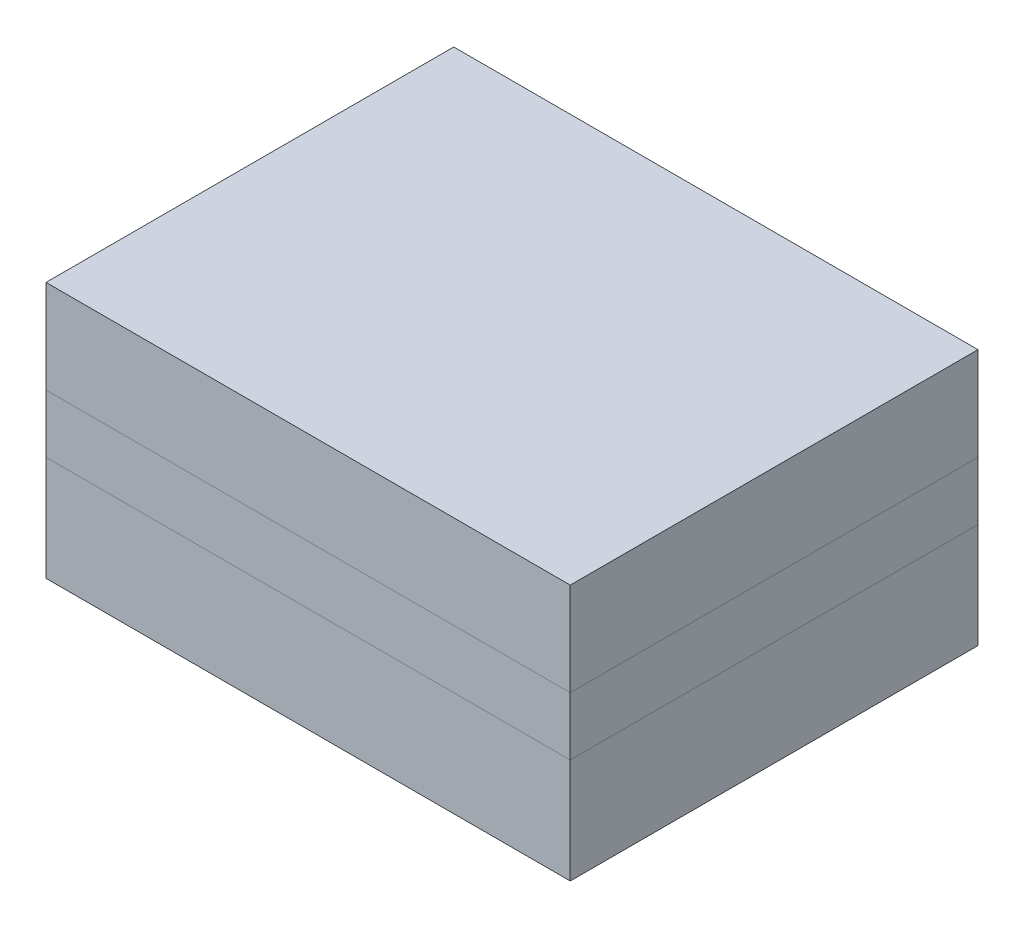
ISO-10303-21;
HEADER;
FILE_DESCRIPTION(('STEP AP214'),'2;1');
FILE_NAME('part.step','',(''),(''),'','','');
FILE_SCHEMA(('AUTOMOTIVE_DESIGN { 1 0 10303 214 1 1 1 1 }'));
ENDSEC;
DATA;
#1=APPLICATION_CONTEXT('core data for automotive mechanical design processes');
#2=APPLICATION_PROTOCOL_DEFINITION('international standard','automotive_design',2000,#1);
#3=PRODUCT_CONTEXT('',#1,'mechanical');
#4=PRODUCT('Part','Part','',(#3));
#5=PRODUCT_RELATED_PRODUCT_CATEGORY('part','',(#4));
#6=PRODUCT_DEFINITION_FORMATION('','',#4);
#7=PRODUCT_DEFINITION_CONTEXT('part definition',#1,'design');
#8=PRODUCT_DEFINITION('design','',#6,#7);
#9=PRODUCT_DEFINITION_SHAPE('','',#8);
#10=(LENGTH_UNIT() NAMED_UNIT(*) SI_UNIT(.MILLI.,.METRE.));
#11=(NAMED_UNIT(*) PLANE_ANGLE_UNIT() SI_UNIT($,.RADIAN.));
#12=(NAMED_UNIT(*) SI_UNIT($,.STERADIAN.) SOLID_ANGLE_UNIT());
#13=UNCERTAINTY_MEASURE_WITH_UNIT(LENGTH_MEASURE(1.E-05),#10,'distance_accuracy_value','');
#14=(GEOMETRIC_REPRESENTATION_CONTEXT(3) GLOBAL_UNCERTAINTY_ASSIGNED_CONTEXT((#13)) GLOBAL_UNIT_ASSIGNED_CONTEXT((#10,
#11,#12)) REPRESENTATION_CONTEXT('',''));
#15=CARTESIAN_POINT('',(0.,0.,0.));
#16=DIRECTION('',(0.,0.,1.));
#17=DIRECTION('',(1.,0.,0.));
#18=AXIS2_PLACEMENT_3D('',#15,#16,#17);
#19=CARTESIAN_POINT('',(0.,22.,-35.));
#20=DIRECTION('',(1.,0.,0.));
#21=DIRECTION('',(0.,0.,-1.));
#22=AXIS2_PLACEMENT_3D('',#19,#20,#21);
#23=PLANE('',#22);
#24=DIRECTION('',(0.,0.,1.));
#25=VECTOR('',#24,1.);
#26=CARTESIAN_POINT('',(0.,14.,-35.));
#27=LINE('',#26,#25);
#28=CARTESIAN_POINT('',(0.,14.,-35.));
#29=VERTEX_POINT('',#28);
#30=CARTESIAN_POINT('',(0.,14.,0.));
#31=VERTEX_POINT('',#30);
#32=EDGE_CURVE('E117',#29,#31,#27,.T.);
#33=ORIENTED_EDGE('',*,*,#32,.T.);
#34=DIRECTION('',(0.,-1.,0.));
#35=VECTOR('',#34,1.);
#36=CARTESIAN_POINT('',(0.,22.,0.));
#37=LINE('',#36,#35);
#38=CARTESIAN_POINT('',(0.,22.,0.));
#39=VERTEX_POINT('',#38);
#40=EDGE_CURVE('E12',#39,#31,#37,.T.);
#41=ORIENTED_EDGE('',*,*,#40,.F.);
#42=DIRECTION('',(0.,0.,1.));
#43=VECTOR('',#42,1.);
#44=CARTESIAN_POINT('',(0.,22.,-35.));
#45=LINE('',#44,#43);
#46=CARTESIAN_POINT('',(0.,22.,-35.));
#47=VERTEX_POINT('',#46);
#48=EDGE_CURVE('E105',#47,#39,#45,.T.);
#49=ORIENTED_EDGE('',*,*,#48,.F.);
#50=DIRECTION('',(0.,-1.,0.));
#51=VECTOR('',#50,1.);
#52=CARTESIAN_POINT('',(0.,22.,-35.));
#53=LINE('',#52,#51);
#54=EDGE_CURVE('E113',#47,#29,#53,.T.);
#55=ORIENTED_EDGE('',*,*,#54,.T.);
#56=EDGE_LOOP('',(#33,#41,#49,#55));
#57=FACE_BOUND('',#56,.T.);
#58=ADVANCED_FACE('F54',(#57),#23,.F.);
#59=CARTESIAN_POINT('',(0.,22.,0.));
#60=DIRECTION('',(0.,0.,-1.));
#61=DIRECTION('',(-1.,0.,0.));
#62=AXIS2_PLACEMENT_3D('',#59,#60,#61);
#63=PLANE('',#62);
#64=DIRECTION('',(1.,0.,0.));
#65=VECTOR('',#64,1.);
#66=CARTESIAN_POINT('',(0.,14.,0.));
#67=LINE('',#66,#65);
#68=CARTESIAN_POINT('',(45.,14.,0.));
#69=VERTEX_POINT('',#68);
#70=EDGE_CURVE('E109',#31,#69,#67,.T.);
#71=ORIENTED_EDGE('',*,*,#70,.T.);
#72=DIRECTION('',(0.,-1.,0.));
#73=VECTOR('',#72,1.);
#74=CARTESIAN_POINT('',(45.,22.,0.));
#75=LINE('',#74,#73);
#76=CARTESIAN_POINT('',(45.,22.,0.));
#77=VERTEX_POINT('',#76);
#78=EDGE_CURVE('E62',#77,#69,#75,.T.);
#79=ORIENTED_EDGE('',*,*,#78,.F.);
#80=DIRECTION('',(1.,0.,0.));
#81=VECTOR('',#80,1.);
#82=CARTESIAN_POINT('',(0.,22.,0.));
#83=LINE('',#82,#81);
#84=EDGE_CURVE('E100',#39,#77,#83,.T.);
#85=ORIENTED_EDGE('',*,*,#84,.F.);
#86=ORIENTED_EDGE('',*,*,#40,.T.);
#87=EDGE_LOOP('',(#71,#79,#85,#86));
#88=FACE_BOUND('',#87,.T.);
#89=ADVANCED_FACE('F108',(#88),#63,.F.);
#90=CARTESIAN_POINT('',(45.,22.,-35.));
#91=DIRECTION('',(-1.,0.,0.));
#92=DIRECTION('',(0.,0.,1.));
#93=AXIS2_PLACEMENT_3D('',#90,#91,#92);
#94=PLANE('',#93);
#95=DIRECTION('',(0.,0.,-1.));
#96=VECTOR('',#95,1.);
#97=CARTESIAN_POINT('',(45.,14.,-35.));
#98=LINE('',#97,#96);
#99=CARTESIAN_POINT('',(45.,14.,-35.));
#100=VERTEX_POINT('',#99);
#101=EDGE_CURVE('E87',#69,#100,#98,.T.);
#102=ORIENTED_EDGE('',*,*,#101,.T.);
#103=DIRECTION('',(0.,-1.,0.));
#104=VECTOR('',#103,1.);
#105=CARTESIAN_POINT('',(45.,22.,-35.));
#106=LINE('',#105,#104);
#107=CARTESIAN_POINT('',(45.,22.,-35.));
#108=VERTEX_POINT('',#107);
#109=EDGE_CURVE('E110',#108,#100,#106,.T.);
#110=ORIENTED_EDGE('',*,*,#109,.F.);
#111=DIRECTION('',(0.,0.,-1.));
#112=VECTOR('',#111,1.);
#113=CARTESIAN_POINT('',(45.,22.,-35.));
#114=LINE('',#113,#112);
#115=EDGE_CURVE('E103',#77,#108,#114,.T.);
#116=ORIENTED_EDGE('',*,*,#115,.F.);
#117=ORIENTED_EDGE('',*,*,#78,.T.);
#118=EDGE_LOOP('',(#102,#110,#116,#117));
#119=FACE_BOUND('',#118,.T.);
#120=ADVANCED_FACE('F111',(#119),#94,.F.);
#121=CARTESIAN_POINT('',(0.,22.,-35.));
#122=DIRECTION('',(0.,0.,1.));
#123=DIRECTION('',(1.,0.,0.));
#124=AXIS2_PLACEMENT_3D('',#121,#122,#123);
#125=PLANE('',#124);
#126=DIRECTION('',(-1.,0.,0.));
#127=VECTOR('',#126,1.);
#128=CARTESIAN_POINT('',(0.,14.,-35.));
#129=LINE('',#128,#127);
#130=EDGE_CURVE('E93',#100,#29,#129,.T.);
#131=ORIENTED_EDGE('',*,*,#130,.T.);
#132=ORIENTED_EDGE('',*,*,#54,.F.);
#133=DIRECTION('',(-1.,0.,0.));
#134=VECTOR('',#133,1.);
#135=CARTESIAN_POINT('',(0.,22.,-35.));
#136=LINE('',#135,#134);
#137=EDGE_CURVE('E70',#108,#47,#136,.T.);
#138=ORIENTED_EDGE('',*,*,#137,.F.);
#139=ORIENTED_EDGE('',*,*,#109,.T.);
#140=EDGE_LOOP('',(#131,#132,#138,#139));
#141=FACE_BOUND('',#140,.T.);
#142=ADVANCED_FACE('F124',(#141),#125,.F.);
#143=CARTESIAN_POINT('',(0.,22.,0.));
#144=DIRECTION('',(0.,1.,0.));
#145=DIRECTION('',(0.,0.,1.));
#146=AXIS2_PLACEMENT_3D('',#143,#144,#145);
#147=PLANE('',#146);
#148=ORIENTED_EDGE('',*,*,#48,.T.);
#149=ORIENTED_EDGE('',*,*,#84,.T.);
#150=ORIENTED_EDGE('',*,*,#115,.T.);
#151=ORIENTED_EDGE('',*,*,#137,.T.);
#152=EDGE_LOOP('',(#148,#149,#150,#151));
#153=FACE_BOUND('',#152,.T.);
#154=ADVANCED_FACE('F101',(#153),#147,.T.);
#155=CARTESIAN_POINT('',(0.,14.,0.));
#156=DIRECTION('',(0.,1.,0.));
#157=DIRECTION('',(0.,0.,1.));
#158=AXIS2_PLACEMENT_3D('',#155,#156,#157);
#159=PLANE('',#158);
#160=ORIENTED_EDGE('',*,*,#32,.F.);
#161=ORIENTED_EDGE('',*,*,#130,.F.);
#162=ORIENTED_EDGE('',*,*,#101,.F.);
#163=ORIENTED_EDGE('',*,*,#70,.F.);
#164=EDGE_LOOP('',(#160,#161,#162,#163));
#165=FACE_BOUND('',#164,.T.);
#166=ADVANCED_FACE('F127',(#165),#159,.F.);
#167=CLOSED_SHELL('',(#58,#89,#120,#142,#154,#166));
#168=MANIFOLD_SOLID_BREP('B2',#167);
#169=CARTESIAN_POINT('',(0.,14.,0.));
#170=DIRECTION('',(0.,1.,0.));
#171=DIRECTION('',(0.,0.,1.));
#172=AXIS2_PLACEMENT_3D('',#169,#170,#171);
#173=PLANE('',#172);
#174=DIRECTION('',(0.,0.,1.));
#175=VECTOR('',#174,1.);
#176=CARTESIAN_POINT('',(0.,14.,-35.));
#177=LINE('',#176,#175);
#178=CARTESIAN_POINT('',(0.,14.,-35.));
#179=VERTEX_POINT('',#178);
#180=CARTESIAN_POINT('',(0.,14.,0.));
#181=VERTEX_POINT('',#180);
#182=EDGE_CURVE('E288',#179,#181,#177,.T.);
#183=ORIENTED_EDGE('',*,*,#182,.T.);
#184=DIRECTION('',(1.,0.,0.));
#185=VECTOR('',#184,1.);
#186=CARTESIAN_POINT('',(0.,14.,0.));
#187=LINE('',#186,#185);
#188=CARTESIAN_POINT('',(45.,14.,0.));
#189=VERTEX_POINT('',#188);
#190=EDGE_CURVE('E291',#181,#189,#187,.T.);
#191=ORIENTED_EDGE('',*,*,#190,.T.);
#192=DIRECTION('',(0.,0.,-1.));
#193=VECTOR('',#192,1.);
#194=CARTESIAN_POINT('',(45.,14.,-35.));
#195=LINE('',#194,#193);
#196=CARTESIAN_POINT('',(45.,14.,-35.));
#197=VERTEX_POINT('',#196);
#198=EDGE_CURVE('E294',#189,#197,#195,.T.);
#199=ORIENTED_EDGE('',*,*,#198,.T.);
#200=DIRECTION('',(-1.,0.,0.));
#201=VECTOR('',#200,1.);
#202=CARTESIAN_POINT('',(0.,14.,-35.));
#203=LINE('',#202,#201);
#204=EDGE_CURVE('E296',#197,#179,#203,.T.);
#205=ORIENTED_EDGE('',*,*,#204,.T.);
#206=EDGE_LOOP('',(#183,#191,#199,#205));
#207=FACE_BOUND('',#206,.T.);
#208=DIRECTION('',(0.,0.,1.));
#209=VECTOR('',#208,1.);
#210=CARTESIAN_POINT('',(10.,14.,-25.));
#211=LINE('',#210,#209);
#212=CARTESIAN_POINT('',(10.,14.,-25.));
#213=VERTEX_POINT('',#212);
#214=CARTESIAN_POINT('',(10.,14.,-10.));
#215=VERTEX_POINT('',#214);
#216=EDGE_CURVE('E260',#213,#215,#211,.T.);
#217=ORIENTED_EDGE('',*,*,#216,.F.);
#218=DIRECTION('',(-1.,0.,0.));
#219=VECTOR('',#218,1.);
#220=CARTESIAN_POINT('',(10.,14.,-25.));
#221=LINE('',#220,#219);
#222=CARTESIAN_POINT('',(35.,14.,-25.));
#223=VERTEX_POINT('',#222);
#224=EDGE_CURVE('E252',#223,#213,#221,.T.);
#225=ORIENTED_EDGE('',*,*,#224,.F.);
#226=DIRECTION('',(0.,0.,-1.));
#227=VECTOR('',#226,1.);
#228=CARTESIAN_POINT('',(35.,14.,-25.));
#229=LINE('',#228,#227);
#230=CARTESIAN_POINT('',(35.,14.,-10.));
#231=VERTEX_POINT('',#230);
#232=EDGE_CURVE('E274',#231,#223,#229,.T.);
#233=ORIENTED_EDGE('',*,*,#232,.F.);
#234=DIRECTION('',(1.,0.,0.));
#235=VECTOR('',#234,1.);
#236=CARTESIAN_POINT('',(10.,14.,-10.));
#237=LINE('',#236,#235);
#238=EDGE_CURVE('E272',#215,#231,#237,.T.);
#239=ORIENTED_EDGE('',*,*,#238,.F.);
#240=EDGE_LOOP('',(#217,#225,#233,#239));
#241=FACE_BOUND('',#240,.T.);
#242=ADVANCED_FACE('F187',(#207,#241),#173,.T.);
#243=CARTESIAN_POINT('',(0.,9.,0.));
#244=DIRECTION('',(0.,1.,0.));
#245=DIRECTION('',(0.,0.,1.));
#246=AXIS2_PLACEMENT_3D('',#243,#244,#245);
#247=PLANE('',#246);
#248=DIRECTION('',(0.,0.,1.));
#249=VECTOR('',#248,1.);
#250=CARTESIAN_POINT('',(0.,9.,-35.));
#251=LINE('',#250,#249);
#252=CARTESIAN_POINT('',(0.,9.,-35.));
#253=VERTEX_POINT('',#252);
#254=CARTESIAN_POINT('',(0.,9.,0.));
#255=VERTEX_POINT('',#254);
#256=EDGE_CURVE('E268',#253,#255,#251,.T.);
#257=ORIENTED_EDGE('',*,*,#256,.F.);
#258=DIRECTION('',(-1.,0.,0.));
#259=VECTOR('',#258,1.);
#260=CARTESIAN_POINT('',(0.,9.,-35.));
#261=LINE('',#260,#259);
#262=CARTESIAN_POINT('',(45.,9.,-35.));
#263=VERTEX_POINT('',#262);
#264=EDGE_CURVE('E292',#263,#253,#261,.T.);
#265=ORIENTED_EDGE('',*,*,#264,.F.);
#266=DIRECTION('',(0.,0.,-1.));
#267=VECTOR('',#266,1.);
#268=CARTESIAN_POINT('',(45.,9.,-35.));
#269=LINE('',#268,#267);
#270=CARTESIAN_POINT('',(45.,9.,0.));
#271=VERTEX_POINT('',#270);
#272=EDGE_CURVE('E303',#271,#263,#269,.T.);
#273=ORIENTED_EDGE('',*,*,#272,.F.);
#274=DIRECTION('',(1.,0.,0.));
#275=VECTOR('',#274,1.);
#276=CARTESIAN_POINT('',(0.,9.,0.));
#277=LINE('',#276,#275);
#278=EDGE_CURVE('E301',#255,#271,#277,.T.);
#279=ORIENTED_EDGE('',*,*,#278,.F.);
#280=EDGE_LOOP('',(#257,#265,#273,#279));
#281=FACE_BOUND('',#280,.T.);
#282=DIRECTION('',(-1.,0.,0.));
#283=VECTOR('',#282,1.);
#284=CARTESIAN_POINT('',(10.,9.,-25.));
#285=LINE('',#284,#283);
#286=CARTESIAN_POINT('',(35.,9.,-25.));
#287=VERTEX_POINT('',#286);
#288=CARTESIAN_POINT('',(10.,9.,-25.));
#289=VERTEX_POINT('',#288);
#290=EDGE_CURVE('E210',#287,#289,#285,.T.);
#291=ORIENTED_EDGE('',*,*,#290,.T.);
#292=DIRECTION('',(0.,0.,1.));
#293=VECTOR('',#292,1.);
#294=CARTESIAN_POINT('',(10.,9.,-25.));
#295=LINE('',#294,#293);
#296=CARTESIAN_POINT('',(10.,9.,-10.));
#297=VERTEX_POINT('',#296);
#298=EDGE_CURVE('E267',#289,#297,#295,.T.);
#299=ORIENTED_EDGE('',*,*,#298,.T.);
#300=DIRECTION('',(1.,0.,0.));
#301=VECTOR('',#300,1.);
#302=CARTESIAN_POINT('',(10.,9.,-10.));
#303=LINE('',#302,#301);
#304=CARTESIAN_POINT('',(35.,9.,-10.));
#305=VERTEX_POINT('',#304);
#306=EDGE_CURVE('E280',#297,#305,#303,.T.);
#307=ORIENTED_EDGE('',*,*,#306,.T.);
#308=DIRECTION('',(0.,0.,-1.));
#309=VECTOR('',#308,1.);
#310=CARTESIAN_POINT('',(35.,9.,-25.));
#311=LINE('',#310,#309);
#312=EDGE_CURVE('E261',#305,#287,#311,.T.);
#313=ORIENTED_EDGE('',*,*,#312,.T.);
#314=EDGE_LOOP('',(#291,#299,#307,#313));
#315=FACE_BOUND('',#314,.T.);
#316=ADVANCED_FACE('F321',(#281,#315),#247,.F.);
#317=CARTESIAN_POINT('',(0.,14.,-35.));
#318=DIRECTION('',(1.,0.,0.));
#319=DIRECTION('',(0.,0.,-1.));
#320=AXIS2_PLACEMENT_3D('',#317,#318,#319);
#321=PLANE('',#320);
#322=ORIENTED_EDGE('',*,*,#256,.T.);
#323=DIRECTION('',(0.,-1.,0.));
#324=VECTOR('',#323,1.);
#325=CARTESIAN_POINT('',(0.,14.,0.));
#326=LINE('',#325,#324);
#327=EDGE_CURVE('E52',#181,#255,#326,.T.);
#328=ORIENTED_EDGE('',*,*,#327,.F.);
#329=ORIENTED_EDGE('',*,*,#182,.F.);
#330=DIRECTION('',(0.,-1.,0.));
#331=VECTOR('',#330,1.);
#332=CARTESIAN_POINT('',(0.,14.,-35.));
#333=LINE('',#332,#331);
#334=EDGE_CURVE('E298',#179,#253,#333,.T.);
#335=ORIENTED_EDGE('',*,*,#334,.T.);
#336=EDGE_LOOP('',(#322,#328,#329,#335));
#337=FACE_BOUND('',#336,.T.);
#338=ADVANCED_FACE('F189',(#337),#321,.F.);
#339=CARTESIAN_POINT('',(0.,14.,0.));
#340=DIRECTION('',(0.,0.,-1.));
#341=DIRECTION('',(-1.,0.,0.));
#342=AXIS2_PLACEMENT_3D('',#339,#340,#341);
#343=PLANE('',#342);
#344=ORIENTED_EDGE('',*,*,#278,.T.);
#345=DIRECTION('',(0.,-1.,0.));
#346=VECTOR('',#345,1.);
#347=CARTESIAN_POINT('',(45.,14.,0.));
#348=LINE('',#347,#346);
#349=EDGE_CURVE('E195',#189,#271,#348,.T.);
#350=ORIENTED_EDGE('',*,*,#349,.F.);
#351=ORIENTED_EDGE('',*,*,#190,.F.);
#352=ORIENTED_EDGE('',*,*,#327,.T.);
#353=EDGE_LOOP('',(#344,#350,#351,#352));
#354=FACE_BOUND('',#353,.T.);
#355=ADVANCED_FACE('F331',(#354),#343,.F.);
#356=CARTESIAN_POINT('',(45.,14.,-35.));
#357=DIRECTION('',(-1.,0.,0.));
#358=DIRECTION('',(0.,0.,1.));
#359=AXIS2_PLACEMENT_3D('',#356,#357,#358);
#360=PLANE('',#359);
#361=ORIENTED_EDGE('',*,*,#272,.T.);
#362=DIRECTION('',(0.,-1.,0.));
#363=VECTOR('',#362,1.);
#364=CARTESIAN_POINT('',(45.,14.,-35.));
#365=LINE('',#364,#363);
#366=EDGE_CURVE('E308',#197,#263,#365,.T.);
#367=ORIENTED_EDGE('',*,*,#366,.F.);
#368=ORIENTED_EDGE('',*,*,#198,.F.);
#369=ORIENTED_EDGE('',*,*,#349,.T.);
#370=EDGE_LOOP('',(#361,#367,#368,#369));
#371=FACE_BOUND('',#370,.T.);
#372=ADVANCED_FACE('F315',(#371),#360,.F.);
#373=CARTESIAN_POINT('',(0.,14.,-35.));
#374=DIRECTION('',(0.,0.,1.));
#375=DIRECTION('',(1.,0.,0.));
#376=AXIS2_PLACEMENT_3D('',#373,#374,#375);
#377=PLANE('',#376);
#378=ORIENTED_EDGE('',*,*,#264,.T.);
#379=ORIENTED_EDGE('',*,*,#334,.F.);
#380=ORIENTED_EDGE('',*,*,#204,.F.);
#381=ORIENTED_EDGE('',*,*,#366,.T.);
#382=EDGE_LOOP('',(#378,#379,#380,#381));
#383=FACE_BOUND('',#382,.T.);
#384=ADVANCED_FACE('F325',(#383),#377,.F.);
#385=CARTESIAN_POINT('',(10.,14.,-25.));
#386=DIRECTION('',(0.,0.,1.));
#387=DIRECTION('',(1.,0.,0.));
#388=AXIS2_PLACEMENT_3D('',#385,#386,#387);
#389=PLANE('',#388);
#390=ORIENTED_EDGE('',*,*,#290,.F.);
#391=DIRECTION('',(0.,-1.,0.));
#392=VECTOR('',#391,1.);
#393=CARTESIAN_POINT('',(35.,14.,-25.));
#394=LINE('',#393,#392);
#395=EDGE_CURVE('E256',#223,#287,#394,.T.);
#396=ORIENTED_EDGE('',*,*,#395,.F.);
#397=ORIENTED_EDGE('',*,*,#224,.T.);
#398=DIRECTION('',(0.,-1.,0.));
#399=VECTOR('',#398,1.);
#400=CARTESIAN_POINT('',(10.,14.,-25.));
#401=LINE('',#400,#399);
#402=EDGE_CURVE('E255',#213,#289,#401,.T.);
#403=ORIENTED_EDGE('',*,*,#402,.T.);
#404=EDGE_LOOP('',(#390,#396,#397,#403));
#405=FACE_BOUND('',#404,.T.);
#406=ADVANCED_FACE('F254',(#405),#389,.T.);
#407=CARTESIAN_POINT('',(10.,14.,-25.));
#408=DIRECTION('',(1.,0.,0.));
#409=DIRECTION('',(0.,0.,-1.));
#410=AXIS2_PLACEMENT_3D('',#407,#408,#409);
#411=PLANE('',#410);
#412=ORIENTED_EDGE('',*,*,#298,.F.);
#413=ORIENTED_EDGE('',*,*,#402,.F.);
#414=ORIENTED_EDGE('',*,*,#216,.T.);
#415=DIRECTION('',(0.,-1.,0.));
#416=VECTOR('',#415,1.);
#417=CARTESIAN_POINT('',(10.,14.,-10.));
#418=LINE('',#417,#416);
#419=EDGE_CURVE('E269',#215,#297,#418,.T.);
#420=ORIENTED_EDGE('',*,*,#419,.T.);
#421=EDGE_LOOP('',(#412,#413,#414,#420));
#422=FACE_BOUND('',#421,.T.);
#423=ADVANCED_FACE('F264',(#422),#411,.T.);
#424=CARTESIAN_POINT('',(10.,14.,-10.));
#425=DIRECTION('',(0.,0.,-1.));
#426=DIRECTION('',(-1.,0.,0.));
#427=AXIS2_PLACEMENT_3D('',#424,#425,#426);
#428=PLANE('',#427);
#429=ORIENTED_EDGE('',*,*,#306,.F.);
#430=ORIENTED_EDGE('',*,*,#419,.F.);
#431=ORIENTED_EDGE('',*,*,#238,.T.);
#432=DIRECTION('',(0.,-1.,0.));
#433=VECTOR('',#432,1.);
#434=CARTESIAN_POINT('',(35.,14.,-10.));
#435=LINE('',#434,#433);
#436=EDGE_CURVE('E202',#231,#305,#435,.T.);
#437=ORIENTED_EDGE('',*,*,#436,.T.);
#438=EDGE_LOOP('',(#429,#430,#431,#437));
#439=FACE_BOUND('',#438,.T.);
#440=ADVANCED_FACE('F354',(#439),#428,.T.);
#441=CARTESIAN_POINT('',(35.,14.,-25.));
#442=DIRECTION('',(-1.,0.,0.));
#443=DIRECTION('',(0.,0.,1.));
#444=AXIS2_PLACEMENT_3D('',#441,#442,#443);
#445=PLANE('',#444);
#446=ORIENTED_EDGE('',*,*,#312,.F.);
#447=ORIENTED_EDGE('',*,*,#436,.F.);
#448=ORIENTED_EDGE('',*,*,#232,.T.);
#449=ORIENTED_EDGE('',*,*,#395,.T.);
#450=EDGE_LOOP('',(#446,#447,#448,#449));
#451=FACE_BOUND('',#450,.T.);
#452=ADVANCED_FACE('F358',(#451),#445,.T.);
#453=CLOSED_SHELL('',(#242,#316,#338,#355,#372,#384,#406,#423,#440,#452));
#454=MANIFOLD_SOLID_BREP('B6',#453);
#455=CARTESIAN_POINT('',(0.,9.,0.));
#456=DIRECTION('',(1.,0.,0.));
#457=DIRECTION('',(0.,0.,-1.));
#458=AXIS2_PLACEMENT_3D('',#455,#456,#457);
#459=PLANE('',#458);
#460=DIRECTION('',(0.,0.,1.));
#461=VECTOR('',#460,1.);
#462=CARTESIAN_POINT('',(0.,0.,0.));
#463=LINE('',#462,#461);
#464=CARTESIAN_POINT('',(0.,0.,-35.));
#465=VERTEX_POINT('',#464);
#466=CARTESIAN_POINT('',(0.,0.,0.));
#467=VERTEX_POINT('',#466);
#468=EDGE_CURVE('E480',#465,#467,#463,.T.);
#469=ORIENTED_EDGE('',*,*,#468,.T.);
#470=DIRECTION('',(0.,-1.,0.));
#471=VECTOR('',#470,1.);
#472=CARTESIAN_POINT('',(0.,9.,0.));
#473=LINE('',#472,#471);
#474=CARTESIAN_POINT('',(0.,9.,0.));
#475=VERTEX_POINT('',#474);
#476=EDGE_CURVE('E185',#475,#467,#473,.T.);
#477=ORIENTED_EDGE('',*,*,#476,.F.);
#478=DIRECTION('',(0.,0.,1.));
#479=VECTOR('',#478,1.);
#480=CARTESIAN_POINT('',(0.,9.,0.));
#481=LINE('',#480,#479);
#482=CARTESIAN_POINT('',(0.,9.,-35.));
#483=VERTEX_POINT('',#482);
#484=EDGE_CURVE('E468',#483,#475,#481,.T.);
#485=ORIENTED_EDGE('',*,*,#484,.F.);
#486=DIRECTION('',(0.,-1.,0.));
#487=VECTOR('',#486,1.);
#488=CARTESIAN_POINT('',(0.,9.,-35.));
#489=LINE('',#488,#487);
#490=EDGE_CURVE('E476',#483,#465,#489,.T.);
#491=ORIENTED_EDGE('',*,*,#490,.T.);
#492=EDGE_LOOP('',(#469,#477,#485,#491));
#493=FACE_BOUND('',#492,.T.);
#494=ADVANCED_FACE('F417',(#493),#459,.F.);
#495=CARTESIAN_POINT('',(0.,9.,0.));
#496=DIRECTION('',(0.,0.,-1.));
#497=DIRECTION('',(-1.,0.,0.));
#498=AXIS2_PLACEMENT_3D('',#495,#496,#497);
#499=PLANE('',#498);
#500=DIRECTION('',(1.,0.,0.));
#501=VECTOR('',#500,1.);
#502=CARTESIAN_POINT('',(0.,0.,0.));
#503=LINE('',#502,#501);
#504=CARTESIAN_POINT('',(45.,0.,0.));
#505=VERTEX_POINT('',#504);
#506=EDGE_CURVE('E472',#467,#505,#503,.T.);
#507=ORIENTED_EDGE('',*,*,#506,.T.);
#508=DIRECTION('',(0.,-1.,0.));
#509=VECTOR('',#508,1.);
#510=CARTESIAN_POINT('',(45.,9.,0.));
#511=LINE('',#510,#509);
#512=CARTESIAN_POINT('',(45.,9.,0.));
#513=VERTEX_POINT('',#512);
#514=EDGE_CURVE('E425',#513,#505,#511,.T.);
#515=ORIENTED_EDGE('',*,*,#514,.F.);
#516=DIRECTION('',(1.,0.,0.));
#517=VECTOR('',#516,1.);
#518=CARTESIAN_POINT('',(0.,9.,0.));
#519=LINE('',#518,#517);
#520=EDGE_CURVE('E463',#475,#513,#519,.T.);
#521=ORIENTED_EDGE('',*,*,#520,.F.);
#522=ORIENTED_EDGE('',*,*,#476,.T.);
#523=EDGE_LOOP('',(#507,#515,#521,#522));
#524=FACE_BOUND('',#523,.T.);
#525=ADVANCED_FACE('F471',(#524),#499,.F.);
#526=CARTESIAN_POINT('',(45.,9.,0.));
#527=DIRECTION('',(-1.,0.,0.));
#528=DIRECTION('',(0.,0.,1.));
#529=AXIS2_PLACEMENT_3D('',#526,#527,#528);
#530=PLANE('',#529);
#531=DIRECTION('',(0.,0.,-1.));
#532=VECTOR('',#531,1.);
#533=CARTESIAN_POINT('',(45.,0.,0.));
#534=LINE('',#533,#532);
#535=CARTESIAN_POINT('',(45.,0.,-35.));
#536=VERTEX_POINT('',#535);
#537=EDGE_CURVE('E450',#505,#536,#534,.T.);
#538=ORIENTED_EDGE('',*,*,#537,.T.);
#539=DIRECTION('',(0.,-1.,0.));
#540=VECTOR('',#539,1.);
#541=CARTESIAN_POINT('',(45.,9.,-35.));
#542=LINE('',#541,#540);
#543=CARTESIAN_POINT('',(45.,9.,-35.));
#544=VERTEX_POINT('',#543);
#545=EDGE_CURVE('E473',#544,#536,#542,.T.);
#546=ORIENTED_EDGE('',*,*,#545,.F.);
#547=DIRECTION('',(0.,0.,-1.));
#548=VECTOR('',#547,1.);
#549=CARTESIAN_POINT('',(45.,9.,0.));
#550=LINE('',#549,#548);
#551=EDGE_CURVE('E466',#513,#544,#550,.T.);
#552=ORIENTED_EDGE('',*,*,#551,.F.);
#553=ORIENTED_EDGE('',*,*,#514,.T.);
#554=EDGE_LOOP('',(#538,#546,#552,#553));
#555=FACE_BOUND('',#554,.T.);
#556=ADVANCED_FACE('F474',(#555),#530,.F.);
#557=CARTESIAN_POINT('',(0.,9.,-35.));
#558=DIRECTION('',(0.,0.,1.));
#559=DIRECTION('',(1.,0.,0.));
#560=AXIS2_PLACEMENT_3D('',#557,#558,#559);
#561=PLANE('',#560);
#562=DIRECTION('',(-1.,0.,0.));
#563=VECTOR('',#562,1.);
#564=CARTESIAN_POINT('',(0.,0.,-35.));
#565=LINE('',#564,#563);
#566=EDGE_CURVE('E456',#536,#465,#565,.T.);
#567=ORIENTED_EDGE('',*,*,#566,.T.);
#568=ORIENTED_EDGE('',*,*,#490,.F.);
#569=DIRECTION('',(-1.,0.,0.));
#570=VECTOR('',#569,1.);
#571=CARTESIAN_POINT('',(0.,9.,-35.));
#572=LINE('',#571,#570);
#573=EDGE_CURVE('E433',#544,#483,#572,.T.);
#574=ORIENTED_EDGE('',*,*,#573,.F.);
#575=ORIENTED_EDGE('',*,*,#545,.T.);
#576=EDGE_LOOP('',(#567,#568,#574,#575));
#577=FACE_BOUND('',#576,.T.);
#578=ADVANCED_FACE('F487',(#577),#561,.F.);
#579=CARTESIAN_POINT('',(0.,9.,0.));
#580=DIRECTION('',(0.,-1.,0.));
#581=DIRECTION('',(0.,0.,-1.));
#582=AXIS2_PLACEMENT_3D('',#579,#580,#581);
#583=PLANE('',#582);
#584=ORIENTED_EDGE('',*,*,#484,.T.);
#585=ORIENTED_EDGE('',*,*,#520,.T.);
#586=ORIENTED_EDGE('',*,*,#551,.T.);
#587=ORIENTED_EDGE('',*,*,#573,.T.);
#588=EDGE_LOOP('',(#584,#585,#586,#587));
#589=FACE_BOUND('',#588,.T.);
#590=ADVANCED_FACE('F464',(#589),#583,.F.);
#591=CARTESIAN_POINT('',(0.,0.,0.));
#592=DIRECTION('',(0.,-1.,0.));
#593=DIRECTION('',(0.,0.,-1.));
#594=AXIS2_PLACEMENT_3D('',#591,#592,#593);
#595=PLANE('',#594);
#596=ORIENTED_EDGE('',*,*,#468,.F.);
#597=ORIENTED_EDGE('',*,*,#566,.F.);
#598=ORIENTED_EDGE('',*,*,#537,.F.);
#599=ORIENTED_EDGE('',*,*,#506,.F.);
#600=EDGE_LOOP('',(#596,#597,#598,#599));
#601=FACE_BOUND('',#600,.T.);
#602=ADVANCED_FACE('F490',(#601),#595,.T.);
#603=CLOSED_SHELL('',(#494,#525,#556,#578,#590,#602));
#604=MANIFOLD_SOLID_BREP('B46',#603);
#605=ADVANCED_BREP_SHAPE_REPRESENTATION('',(#18,#168,#454,#604),#14);
#606=SHAPE_DEFINITION_REPRESENTATION(#9,#605);
ENDSEC;
END-ISO-10303-21;
